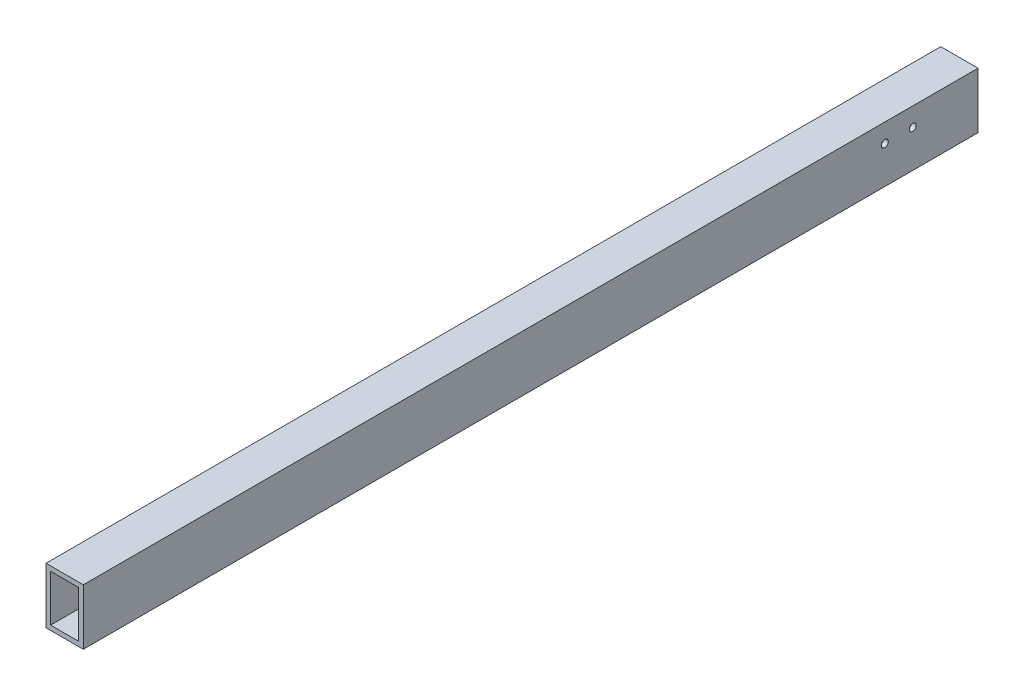
ISO-10303-21;
HEADER;
FILE_DESCRIPTION(('STEP AP214'),'2;1');
FILE_NAME('part.step','',(''),(''),'','','');
FILE_SCHEMA(('AUTOMOTIVE_DESIGN { 1 0 10303 214 1 1 1 1 }'));
ENDSEC;
DATA;
#1=APPLICATION_CONTEXT('core data for automotive mechanical design processes');
#2=APPLICATION_PROTOCOL_DEFINITION('international standard','automotive_design',2000,#1);
#3=PRODUCT_CONTEXT('',#1,'mechanical');
#4=PRODUCT('Part','Part','',(#3));
#5=PRODUCT_RELATED_PRODUCT_CATEGORY('part','',(#4));
#6=PRODUCT_DEFINITION_FORMATION('','',#4);
#7=PRODUCT_DEFINITION_CONTEXT('part definition',#1,'design');
#8=PRODUCT_DEFINITION('design','',#6,#7);
#9=PRODUCT_DEFINITION_SHAPE('','',#8);
#10=(LENGTH_UNIT() NAMED_UNIT(*) SI_UNIT(.MILLI.,.METRE.));
#11=(NAMED_UNIT(*) PLANE_ANGLE_UNIT() SI_UNIT($,.RADIAN.));
#12=(NAMED_UNIT(*) SI_UNIT($,.STERADIAN.) SOLID_ANGLE_UNIT());
#13=UNCERTAINTY_MEASURE_WITH_UNIT(LENGTH_MEASURE(1.E-05),#10,'distance_accuracy_value','');
#14=(GEOMETRIC_REPRESENTATION_CONTEXT(3) GLOBAL_UNCERTAINTY_ASSIGNED_CONTEXT((#13)) GLOBAL_UNIT_ASSIGNED_CONTEXT((#10,
#11,#12)) REPRESENTATION_CONTEXT('',''));
#15=CARTESIAN_POINT('',(0.,0.,0.));
#16=DIRECTION('',(0.,0.,1.));
#17=DIRECTION('',(1.,0.,0.));
#18=AXIS2_PLACEMENT_3D('',#15,#16,#17);
#19=CARTESIAN_POINT('',(12.7,19.05,609.6));
#20=DIRECTION('',(-1.,0.,0.));
#21=DIRECTION('',(0.,-1.,0.));
#22=AXIS2_PLACEMENT_3D('',#19,#20,#21);
#23=PLANE('',#22);
#24=CARTESIAN_POINT('',(12.7,6.35,44.45));
#25=DIRECTION('',(1.,0.,0.));
#26=DIRECTION('',(0.,1.,0.));
#27=AXIS2_PLACEMENT_3D('',#24,#25,#26);
#28=CIRCLE('',#27,2.38125);
#29=CARTESIAN_POINT('',(12.7,8.73125,44.45));
#30=VERTEX_POINT('',#29);
#31=EDGE_CURVE('E171',#30,#30,#28,.T.);
#32=ORIENTED_EDGE('',*,*,#31,.F.);
#33=EDGE_LOOP('',(#32));
#34=FACE_BOUND('',#33,.T.);
#35=CARTESIAN_POINT('',(12.7,6.35,63.5));
#36=DIRECTION('',(1.,0.,0.));
#37=DIRECTION('',(0.,1.,0.));
#38=AXIS2_PLACEMENT_3D('',#35,#36,#37);
#39=CIRCLE('',#38,2.38125);
#40=CARTESIAN_POINT('',(12.7,8.73125,63.5));
#41=VERTEX_POINT('',#40);
#42=EDGE_CURVE('E176',#41,#41,#39,.T.);
#43=ORIENTED_EDGE('',*,*,#42,.F.);
#44=EDGE_LOOP('',(#43));
#45=FACE_BOUND('',#44,.T.);
#46=DIRECTION('',(0.,1.,0.));
#47=VECTOR('',#46,1.);
#48=CARTESIAN_POINT('',(12.7,19.05,0.));
#49=LINE('',#48,#47);
#50=CARTESIAN_POINT('',(12.7,-19.05,0.));
#51=VERTEX_POINT('',#50);
#52=CARTESIAN_POINT('',(12.7,19.05,0.));
#53=VERTEX_POINT('',#52);
#54=EDGE_CURVE('E148',#51,#53,#49,.T.);
#55=ORIENTED_EDGE('',*,*,#54,.T.);
#56=DIRECTION('',(0.,0.,-1.));
#57=VECTOR('',#56,1.);
#58=CARTESIAN_POINT('',(12.7,19.05,609.6));
#59=LINE('',#58,#57);
#60=CARTESIAN_POINT('',(12.7,19.05,609.6));
#61=VERTEX_POINT('',#60);
#62=EDGE_CURVE('E11',#61,#53,#59,.T.);
#63=ORIENTED_EDGE('',*,*,#62,.F.);
#64=DIRECTION('',(0.,1.,0.));
#65=VECTOR('',#64,1.);
#66=CARTESIAN_POINT('',(12.7,19.05,609.6));
#67=LINE('',#66,#65);
#68=CARTESIAN_POINT('',(12.7,-19.05,609.6));
#69=VERTEX_POINT('',#68);
#70=EDGE_CURVE('E137',#69,#61,#67,.T.);
#71=ORIENTED_EDGE('',*,*,#70,.F.);
#72=DIRECTION('',(0.,0.,-1.));
#73=VECTOR('',#72,1.);
#74=CARTESIAN_POINT('',(12.7,-19.05,609.6));
#75=LINE('',#74,#73);
#76=EDGE_CURVE('E147',#69,#51,#75,.T.);
#77=ORIENTED_EDGE('',*,*,#76,.T.);
#78=EDGE_LOOP('',(#55,#63,#71,#77));
#79=FACE_BOUND('',#78,.T.);
#80=ADVANCED_FACE('F37',(#34,#45,#79),#23,.F.);
#81=CARTESIAN_POINT('',(-12.7,19.05,609.6));
#82=DIRECTION('',(0.,-1.,0.));
#83=DIRECTION('',(0.,0.,-1.));
#84=AXIS2_PLACEMENT_3D('',#81,#82,#83);
#85=PLANE('',#84);
#86=DIRECTION('',(-1.,0.,0.));
#87=VECTOR('',#86,1.);
#88=CARTESIAN_POINT('',(-12.7,19.05,0.));
#89=LINE('',#88,#87);
#90=CARTESIAN_POINT('',(-12.7,19.05,0.));
#91=VERTEX_POINT('',#90);
#92=EDGE_CURVE('E151',#53,#91,#89,.T.);
#93=ORIENTED_EDGE('',*,*,#92,.T.);
#94=DIRECTION('',(0.,0.,-1.));
#95=VECTOR('',#94,1.);
#96=CARTESIAN_POINT('',(-12.7,19.05,609.6));
#97=LINE('',#96,#95);
#98=CARTESIAN_POINT('',(-12.7,19.05,609.6));
#99=VERTEX_POINT('',#98);
#100=EDGE_CURVE('E45',#99,#91,#97,.T.);
#101=ORIENTED_EDGE('',*,*,#100,.F.);
#102=DIRECTION('',(-1.,0.,0.));
#103=VECTOR('',#102,1.);
#104=CARTESIAN_POINT('',(-12.7,19.05,609.6));
#105=LINE('',#104,#103);
#106=EDGE_CURVE('E140',#61,#99,#105,.T.);
#107=ORIENTED_EDGE('',*,*,#106,.F.);
#108=ORIENTED_EDGE('',*,*,#62,.T.);
#109=EDGE_LOOP('',(#93,#101,#107,#108));
#110=FACE_BOUND('',#109,.T.);
#111=ADVANCED_FACE('F207',(#110),#85,.F.);
#112=CARTESIAN_POINT('',(-12.7,19.05,609.6));
#113=DIRECTION('',(1.,0.,0.));
#114=DIRECTION('',(0.,1.,0.));
#115=AXIS2_PLACEMENT_3D('',#112,#113,#114);
#116=PLANE('',#115);
#117=CARTESIAN_POINT('',(-12.7,6.35,44.45));
#118=DIRECTION('',(1.,0.,0.));
#119=DIRECTION('',(0.,1.,0.));
#120=AXIS2_PLACEMENT_3D('',#117,#118,#119);
#121=CIRCLE('',#120,2.38125);
#122=CARTESIAN_POINT('',(-12.7,8.73125,44.45));
#123=VERTEX_POINT('',#122);
#124=EDGE_CURVE('E165',#123,#123,#121,.T.);
#125=ORIENTED_EDGE('',*,*,#124,.T.);
#126=EDGE_LOOP('',(#125));
#127=FACE_BOUND('',#126,.T.);
#128=CARTESIAN_POINT('',(-12.7,6.35,63.5));
#129=DIRECTION('',(1.,0.,0.));
#130=DIRECTION('',(0.,1.,0.));
#131=AXIS2_PLACEMENT_3D('',#128,#129,#130);
#132=CIRCLE('',#131,2.38125);
#133=CARTESIAN_POINT('',(-12.7,8.73125,63.5));
#134=VERTEX_POINT('',#133);
#135=EDGE_CURVE('E181',#134,#134,#132,.T.);
#136=ORIENTED_EDGE('',*,*,#135,.T.);
#137=EDGE_LOOP('',(#136));
#138=FACE_BOUND('',#137,.T.);
#139=DIRECTION('',(0.,-1.,0.));
#140=VECTOR('',#139,1.);
#141=CARTESIAN_POINT('',(-12.7,19.05,0.));
#142=LINE('',#141,#140);
#143=CARTESIAN_POINT('',(-12.7,-19.05,0.));
#144=VERTEX_POINT('',#143);
#145=EDGE_CURVE('E153',#91,#144,#142,.T.);
#146=ORIENTED_EDGE('',*,*,#145,.T.);
#147=DIRECTION('',(0.,0.,-1.));
#148=VECTOR('',#147,1.);
#149=CARTESIAN_POINT('',(-12.7,-19.05,609.6));
#150=LINE('',#149,#148);
#151=CARTESIAN_POINT('',(-12.7,-19.05,609.6));
#152=VERTEX_POINT('',#151);
#153=EDGE_CURVE('E158',#152,#144,#150,.T.);
#154=ORIENTED_EDGE('',*,*,#153,.F.);
#155=DIRECTION('',(0.,-1.,0.));
#156=VECTOR('',#155,1.);
#157=CARTESIAN_POINT('',(-12.7,19.05,609.6));
#158=LINE('',#157,#156);
#159=EDGE_CURVE('E143',#99,#152,#158,.T.);
#160=ORIENTED_EDGE('',*,*,#159,.F.);
#161=ORIENTED_EDGE('',*,*,#100,.T.);
#162=EDGE_LOOP('',(#146,#154,#160,#161));
#163=FACE_BOUND('',#162,.T.);
#164=ADVANCED_FACE('F212',(#127,#138,#163),#116,.F.);
#165=CARTESIAN_POINT('',(-12.7,-19.05,609.6));
#166=DIRECTION('',(0.,1.,0.));
#167=DIRECTION('',(0.,0.,1.));
#168=AXIS2_PLACEMENT_3D('',#165,#166,#167);
#169=PLANE('',#168);
#170=DIRECTION('',(1.,0.,0.));
#171=VECTOR('',#170,1.);
#172=CARTESIAN_POINT('',(-12.7,-19.05,0.));
#173=LINE('',#172,#171);
#174=EDGE_CURVE('E141',#144,#51,#173,.T.);
#175=ORIENTED_EDGE('',*,*,#174,.T.);
#176=ORIENTED_EDGE('',*,*,#76,.F.);
#177=DIRECTION('',(1.,0.,0.));
#178=VECTOR('',#177,1.);
#179=CARTESIAN_POINT('',(-12.7,-19.05,609.6));
#180=LINE('',#179,#178);
#181=EDGE_CURVE('E145',#152,#69,#180,.T.);
#182=ORIENTED_EDGE('',*,*,#181,.F.);
#183=ORIENTED_EDGE('',*,*,#153,.T.);
#184=EDGE_LOOP('',(#175,#176,#182,#183));
#185=FACE_BOUND('',#184,.T.);
#186=ADVANCED_FACE('F229',(#185),#169,.F.);
#187=CARTESIAN_POINT('',(0.,0.,609.6));
#188=DIRECTION('',(0.,0.,1.));
#189=DIRECTION('',(1.,0.,0.));
#190=AXIS2_PLACEMENT_3D('',#187,#188,#189);
#191=PLANE('',#190);
#192=DIRECTION('',(0.,1.,0.));
#193=VECTOR('',#192,1.);
#194=CARTESIAN_POINT('',(9.525,19.05,609.6));
#195=LINE('',#194,#193);
#196=CARTESIAN_POINT('',(9.525,-15.875,609.6));
#197=VERTEX_POINT('',#196);
#198=CARTESIAN_POINT('',(9.525,15.875,609.6));
#199=VERTEX_POINT('',#198);
#200=EDGE_CURVE('E125',#197,#199,#195,.T.);
#201=ORIENTED_EDGE('',*,*,#200,.F.);
#202=DIRECTION('',(1.,0.,0.));
#203=VECTOR('',#202,1.);
#204=CARTESIAN_POINT('',(-12.7,-15.875,609.6));
#205=LINE('',#204,#203);
#206=CARTESIAN_POINT('',(-9.525,-15.875,609.6));
#207=VERTEX_POINT('',#206);
#208=EDGE_CURVE('E108',#207,#197,#205,.T.);
#209=ORIENTED_EDGE('',*,*,#208,.F.);
#210=DIRECTION('',(0.,-1.,0.));
#211=VECTOR('',#210,1.);
#212=CARTESIAN_POINT('',(-9.525,19.05,609.6));
#213=LINE('',#212,#211);
#214=CARTESIAN_POINT('',(-9.525,15.875,609.6));
#215=VERTEX_POINT('',#214);
#216=EDGE_CURVE('E134',#215,#207,#213,.T.);
#217=ORIENTED_EDGE('',*,*,#216,.F.);
#218=DIRECTION('',(-1.,0.,0.));
#219=VECTOR('',#218,1.);
#220=CARTESIAN_POINT('',(-12.7,15.875,609.6));
#221=LINE('',#220,#219);
#222=EDGE_CURVE('E127',#199,#215,#221,.T.);
#223=ORIENTED_EDGE('',*,*,#222,.F.);
#224=EDGE_LOOP('',(#201,#209,#217,#223));
#225=FACE_BOUND('',#224,.T.);
#226=ORIENTED_EDGE('',*,*,#70,.T.);
#227=ORIENTED_EDGE('',*,*,#106,.T.);
#228=ORIENTED_EDGE('',*,*,#159,.T.);
#229=ORIENTED_EDGE('',*,*,#181,.T.);
#230=EDGE_LOOP('',(#226,#227,#228,#229));
#231=FACE_BOUND('',#230,.T.);
#232=ADVANCED_FACE('F192',(#225,#231),#191,.T.);
#233=CARTESIAN_POINT('',(0.,0.,0.));
#234=DIRECTION('',(0.,0.,1.));
#235=DIRECTION('',(1.,0.,0.));
#236=AXIS2_PLACEMENT_3D('',#233,#234,#235);
#237=PLANE('',#236);
#238=DIRECTION('',(1.,0.,0.));
#239=VECTOR('',#238,1.);
#240=CARTESIAN_POINT('',(-12.7,-15.875,0.));
#241=LINE('',#240,#239);
#242=CARTESIAN_POINT('',(-9.525,-15.875,0.));
#243=VERTEX_POINT('',#242);
#244=CARTESIAN_POINT('',(9.525,-15.875,0.));
#245=VERTEX_POINT('',#244);
#246=EDGE_CURVE('E106',#243,#245,#241,.T.);
#247=ORIENTED_EDGE('',*,*,#246,.T.);
#248=DIRECTION('',(0.,1.,0.));
#249=VECTOR('',#248,1.);
#250=CARTESIAN_POINT('',(9.525,19.05,0.));
#251=LINE('',#250,#249);
#252=CARTESIAN_POINT('',(9.525,15.875,0.));
#253=VERTEX_POINT('',#252);
#254=EDGE_CURVE('E114',#245,#253,#251,.T.);
#255=ORIENTED_EDGE('',*,*,#254,.T.);
#256=DIRECTION('',(-1.,0.,0.));
#257=VECTOR('',#256,1.);
#258=CARTESIAN_POINT('',(-12.7,15.875,0.));
#259=LINE('',#258,#257);
#260=CARTESIAN_POINT('',(-9.525,15.875,0.));
#261=VERTEX_POINT('',#260);
#262=EDGE_CURVE('E120',#253,#261,#259,.T.);
#263=ORIENTED_EDGE('',*,*,#262,.T.);
#264=DIRECTION('',(0.,-1.,0.));
#265=VECTOR('',#264,1.);
#266=CARTESIAN_POINT('',(-9.525,19.05,0.));
#267=LINE('',#266,#265);
#268=EDGE_CURVE('E60',#261,#243,#267,.T.);
#269=ORIENTED_EDGE('',*,*,#268,.T.);
#270=EDGE_LOOP('',(#247,#255,#263,#269));
#271=FACE_BOUND('',#270,.T.);
#272=ORIENTED_EDGE('',*,*,#54,.F.);
#273=ORIENTED_EDGE('',*,*,#174,.F.);
#274=ORIENTED_EDGE('',*,*,#145,.F.);
#275=ORIENTED_EDGE('',*,*,#92,.F.);
#276=EDGE_LOOP('',(#272,#273,#274,#275));
#277=FACE_BOUND('',#276,.T.);
#278=ADVANCED_FACE('F123',(#271,#277),#237,.F.);
#279=CARTESIAN_POINT('',(9.525,19.05,609.6));
#280=DIRECTION('',(-1.,0.,0.));
#281=DIRECTION('',(0.,-1.,0.));
#282=AXIS2_PLACEMENT_3D('',#279,#280,#281);
#283=PLANE('',#282);
#284=CARTESIAN_POINT('',(9.52499999999999,6.35,44.45));
#285=DIRECTION('',(-1.,0.,0.));
#286=DIRECTION('',(0.,-1.,0.));
#287=AXIS2_PLACEMENT_3D('',#284,#285,#286);
#288=CIRCLE('',#287,2.38125);
#289=CARTESIAN_POINT('',(9.52499999999999,8.73125,44.45));
#290=VERTEX_POINT('',#289);
#291=EDGE_CURVE('E121',#290,#290,#288,.T.);
#292=ORIENTED_EDGE('',*,*,#291,.F.);
#293=EDGE_LOOP('',(#292));
#294=FACE_BOUND('',#293,.T.);
#295=CARTESIAN_POINT('',(9.52499999999999,6.35,63.5));
#296=DIRECTION('',(-1.,0.,0.));
#297=DIRECTION('',(0.,-1.,0.));
#298=AXIS2_PLACEMENT_3D('',#295,#296,#297);
#299=CIRCLE('',#298,2.38125);
#300=CARTESIAN_POINT('',(9.52499999999999,8.73125,63.5));
#301=VERTEX_POINT('',#300);
#302=EDGE_CURVE('E164',#301,#301,#299,.T.);
#303=ORIENTED_EDGE('',*,*,#302,.F.);
#304=EDGE_LOOP('',(#303));
#305=FACE_BOUND('',#304,.T.);
#306=ORIENTED_EDGE('',*,*,#254,.F.);
#307=DIRECTION('',(0.,0.,-1.));
#308=VECTOR('',#307,1.);
#309=CARTESIAN_POINT('',(9.525,-15.875,609.6));
#310=LINE('',#309,#308);
#311=EDGE_CURVE('E102',#197,#245,#310,.T.);
#312=ORIENTED_EDGE('',*,*,#311,.F.);
#313=ORIENTED_EDGE('',*,*,#200,.T.);
#314=DIRECTION('',(0.,0.,-1.));
#315=VECTOR('',#314,1.);
#316=CARTESIAN_POINT('',(9.525,15.875,609.6));
#317=LINE('',#316,#315);
#318=EDGE_CURVE('E117',#199,#253,#317,.T.);
#319=ORIENTED_EDGE('',*,*,#318,.T.);
#320=EDGE_LOOP('',(#306,#312,#313,#319));
#321=FACE_BOUND('',#320,.T.);
#322=ADVANCED_FACE('F115',(#294,#305,#321),#283,.T.);
#323=CARTESIAN_POINT('',(-12.7,15.875,609.6));
#324=DIRECTION('',(0.,-1.,0.));
#325=DIRECTION('',(0.,0.,-1.));
#326=AXIS2_PLACEMENT_3D('',#323,#324,#325);
#327=PLANE('',#326);
#328=ORIENTED_EDGE('',*,*,#262,.F.);
#329=ORIENTED_EDGE('',*,*,#318,.F.);
#330=ORIENTED_EDGE('',*,*,#222,.T.);
#331=DIRECTION('',(0.,0.,-1.));
#332=VECTOR('',#331,1.);
#333=CARTESIAN_POINT('',(-9.525,15.875,609.6));
#334=LINE('',#333,#332);
#335=EDGE_CURVE('E186',#215,#261,#334,.T.);
#336=ORIENTED_EDGE('',*,*,#335,.T.);
#337=EDGE_LOOP('',(#328,#329,#330,#336));
#338=FACE_BOUND('',#337,.T.);
#339=ADVANCED_FACE('F195',(#338),#327,.T.);
#340=CARTESIAN_POINT('',(-9.525,19.05,609.6));
#341=DIRECTION('',(1.,0.,0.));
#342=DIRECTION('',(0.,1.,0.));
#343=AXIS2_PLACEMENT_3D('',#340,#341,#342);
#344=PLANE('',#343);
#345=CARTESIAN_POINT('',(-9.525,6.35,44.45));
#346=DIRECTION('',(1.,0.,0.));
#347=DIRECTION('',(0.,1.,0.));
#348=AXIS2_PLACEMENT_3D('',#345,#346,#347);
#349=CIRCLE('',#348,2.38125);
#350=CARTESIAN_POINT('',(-9.525,8.73125,44.45));
#351=VERTEX_POINT('',#350);
#352=EDGE_CURVE('E40',#351,#351,#349,.T.);
#353=ORIENTED_EDGE('',*,*,#352,.F.);
#354=EDGE_LOOP('',(#353));
#355=FACE_BOUND('',#354,.T.);
#356=CARTESIAN_POINT('',(-9.525,6.35,63.5));
#357=DIRECTION('',(1.,0.,0.));
#358=DIRECTION('',(0.,1.,0.));
#359=AXIS2_PLACEMENT_3D('',#356,#357,#358);
#360=CIRCLE('',#359,2.38125);
#361=CARTESIAN_POINT('',(-9.525,8.73125,63.5));
#362=VERTEX_POINT('',#361);
#363=EDGE_CURVE('E162',#362,#362,#360,.T.);
#364=ORIENTED_EDGE('',*,*,#363,.F.);
#365=EDGE_LOOP('',(#364));
#366=FACE_BOUND('',#365,.T.);
#367=ORIENTED_EDGE('',*,*,#268,.F.);
#368=ORIENTED_EDGE('',*,*,#335,.F.);
#369=ORIENTED_EDGE('',*,*,#216,.T.);
#370=DIRECTION('',(0.,0.,-1.));
#371=VECTOR('',#370,1.);
#372=CARTESIAN_POINT('',(-9.525,-15.875,609.6));
#373=LINE('',#372,#371);
#374=EDGE_CURVE('E53',#207,#243,#373,.T.);
#375=ORIENTED_EDGE('',*,*,#374,.T.);
#376=EDGE_LOOP('',(#367,#368,#369,#375));
#377=FACE_BOUND('',#376,.T.);
#378=ADVANCED_FACE('F188',(#355,#366,#377),#344,.T.);
#379=CARTESIAN_POINT('',(-12.7,-15.875,609.6));
#380=DIRECTION('',(0.,1.,0.));
#381=DIRECTION('',(0.,0.,1.));
#382=AXIS2_PLACEMENT_3D('',#379,#380,#381);
#383=PLANE('',#382);
#384=ORIENTED_EDGE('',*,*,#246,.F.);
#385=ORIENTED_EDGE('',*,*,#374,.F.);
#386=ORIENTED_EDGE('',*,*,#208,.T.);
#387=ORIENTED_EDGE('',*,*,#311,.T.);
#388=EDGE_LOOP('',(#384,#385,#386,#387));
#389=FACE_BOUND('',#388,.T.);
#390=ADVANCED_FACE('F104',(#389),#383,.T.);
#391=CARTESIAN_POINT('',(-12.7,6.35,63.5));
#392=DIRECTION('',(1.,0.,0.));
#393=DIRECTION('',(0.,1.,0.));
#394=AXIS2_PLACEMENT_3D('',#391,#392,#393);
#395=CYLINDRICAL_SURFACE('',#394,2.38125);
#396=CARTESIAN_POINT('',(-9.525,8.73125,63.5));
#397=CARTESIAN_POINT('',(-9.55807291666667,8.73125,63.5));
#398=CARTESIAN_POINT('',(-9.59114583333334,8.73125,63.5));
#399=CARTESIAN_POINT('',(-9.65729166666667,8.73125,63.5));
#400=CARTESIAN_POINT('',(-9.69036458333334,8.73125,63.5));
#401=CARTESIAN_POINT('',(-9.75651041666667,8.73125,63.5));
#402=CARTESIAN_POINT('',(-9.78958333333334,8.73125,63.5));
#403=CARTESIAN_POINT('',(-9.85572916666667,8.73125,63.5));
#404=CARTESIAN_POINT('',(-9.88880208333334,8.73125,63.5));
#405=CARTESIAN_POINT('',(-9.95494791666667,8.73125,63.5));
#406=CARTESIAN_POINT('',(-9.98802083333334,8.73125,63.5));
#407=CARTESIAN_POINT('',(-10.0541666666667,8.73125,63.5));
#408=CARTESIAN_POINT('',(-10.0872395833333,8.73125,63.5));
#409=CARTESIAN_POINT('',(-10.1533854166667,8.73125,63.5));
#410=CARTESIAN_POINT('',(-10.1864583333333,8.73125,63.5));
#411=CARTESIAN_POINT('',(-10.2526041666667,8.73125,63.5));
#412=CARTESIAN_POINT('',(-10.2856770833333,8.73125,63.5));
#413=CARTESIAN_POINT('',(-10.3518229166667,8.73125,63.5));
#414=CARTESIAN_POINT('',(-10.3848958333333,8.73125,63.5));
#415=CARTESIAN_POINT('',(-10.4510416666667,8.73125,63.5));
#416=CARTESIAN_POINT('',(-10.4841145833333,8.73125,63.5));
#417=CARTESIAN_POINT('',(-10.5502604166667,8.73125,63.5));
#418=CARTESIAN_POINT('',(-10.5833333333333,8.73125,63.5));
#419=CARTESIAN_POINT('',(-10.6494791666667,8.73125,63.5));
#420=CARTESIAN_POINT('',(-10.6825520833333,8.73125,63.5));
#421=CARTESIAN_POINT('',(-10.7486979166667,8.73125,63.5));
#422=CARTESIAN_POINT('',(-10.7817708333333,8.73125,63.5));
#423=CARTESIAN_POINT('',(-10.8479166666667,8.73125,63.5));
#424=CARTESIAN_POINT('',(-10.8809895833333,8.73125,63.5));
#425=CARTESIAN_POINT('',(-10.9471354166667,8.73125,63.5));
#426=CARTESIAN_POINT('',(-10.9802083333333,8.73125,63.5));
#427=CARTESIAN_POINT('',(-11.0463541666667,8.73125,63.5));
#428=CARTESIAN_POINT('',(-11.0794270833333,8.73125,63.5));
#429=CARTESIAN_POINT('',(-11.1455729166667,8.73125,63.5));
#430=CARTESIAN_POINT('',(-11.1786458333333,8.73125,63.5));
#431=CARTESIAN_POINT('',(-11.2447916666667,8.73125,63.5));
#432=CARTESIAN_POINT('',(-11.2778645833333,8.73125,63.5));
#433=CARTESIAN_POINT('',(-11.3440104166667,8.73125,63.5));
#434=CARTESIAN_POINT('',(-11.3770833333333,8.73125,63.5));
#435=CARTESIAN_POINT('',(-11.4432291666667,8.73125,63.5));
#436=CARTESIAN_POINT('',(-11.4763020833333,8.73125,63.5));
#437=CARTESIAN_POINT('',(-11.5424479166667,8.73125,63.5));
#438=CARTESIAN_POINT('',(-11.5755208333333,8.73125,63.5));
#439=CARTESIAN_POINT('',(-11.6416666666667,8.73125,63.5));
#440=CARTESIAN_POINT('',(-11.6747395833333,8.73125,63.5));
#441=CARTESIAN_POINT('',(-11.7408854166667,8.73125,63.5));
#442=CARTESIAN_POINT('',(-11.7739583333333,8.73125,63.5));
#443=CARTESIAN_POINT('',(-11.8401041666667,8.73125,63.5));
#444=CARTESIAN_POINT('',(-11.8731770833333,8.73125,63.5));
#445=CARTESIAN_POINT('',(-11.9393229166667,8.73125,63.5));
#446=CARTESIAN_POINT('',(-11.9723958333333,8.73125,63.5));
#447=CARTESIAN_POINT('',(-12.0385416666667,8.73125,63.5));
#448=CARTESIAN_POINT('',(-12.0716145833333,8.73125,63.5));
#449=CARTESIAN_POINT('',(-12.1377604166667,8.73125,63.5));
#450=CARTESIAN_POINT('',(-12.1708333333333,8.73125,63.5));
#451=CARTESIAN_POINT('',(-12.2369791666667,8.73125,63.5));
#452=CARTESIAN_POINT('',(-12.2700520833333,8.73125,63.5));
#453=CARTESIAN_POINT('',(-12.3361979166667,8.73125,63.5));
#454=CARTESIAN_POINT('',(-12.3692708333333,8.73125,63.5));
#455=CARTESIAN_POINT('',(-12.4354166666667,8.73125,63.5));
#456=CARTESIAN_POINT('',(-12.4684895833333,8.73125,63.5));
#457=CARTESIAN_POINT('',(-12.5346354166667,8.73125,63.5));
#458=CARTESIAN_POINT('',(-12.5677083333333,8.73125,63.5));
#459=CARTESIAN_POINT('',(-12.6338541666667,8.73125,63.5));
#460=CARTESIAN_POINT('',(-12.6669270833333,8.73125,63.5));
#461=CARTESIAN_POINT('',(-12.7,8.73125,63.5));
#462=B_SPLINE_CURVE_WITH_KNOTS('',3,(#396,#397,#398,#399,#400,#401,#402,#403,#404,#405,#406,
#407,#408,#409,#410,#411,#412,#413,#414,#415,#416,#417,#418,#419,#420,#421,#422,#423,#424,#425,
#426,#427,#428,#429,#430,#431,#432,#433,#434,#435,#436,#437,#438,#439,#440,#441,#442,#443,#444,
#445,#446,#447,#448,#449,#450,#451,#452,#453,#454,#455,#456,#457,#458,#459,#460,#461),
.UNSPECIFIED.,.F.,.F.,(4,2,2,2,2,2,2,2,2,2,2,2,2,2,2,2,2,2,2,2,2,2,2,2,2,2,2,2,2,2,2,2,4),(0.,
0.0992187499999995,0.198437500000001,0.29765625,0.396875,0.496093750000001,0.5953125,0.69453125,
0.793750000000001,0.892968750000001,0.9921875,1.09140625,1.190625,1.28984375,1.3890625,
1.48828125,1.5875,1.68671875,1.7859375,1.88515625,1.984375,2.08359375,2.1828125,2.28203125,
2.38125,2.48046875,2.5796875,2.67890625,2.778125,2.87734375,2.9765625,3.07578125,3.175),.UNSPECIFIED.);
#463=EDGE_CURVE('BSEAM244',#362,#134,#462,.T.);
#464=ORIENTED_EDGE('',*,*,#363,.T.);
#465=ORIENTED_EDGE('',*,*,#135,.F.);
#466=ORIENTED_EDGE('',*,*,#463,.T.);
#467=ORIENTED_EDGE('',*,*,#463,.F.);
#468=EDGE_LOOP('',(#464,#466,#465,#467));
#469=FACE_BOUND('',#468,.T.);
#470=ADVANCED_FACE('F244',(#469),#395,.F.);
#471=CARTESIAN_POINT('',(-12.7,6.35,44.45));
#472=DIRECTION('',(1.,0.,0.));
#473=DIRECTION('',(0.,1.,0.));
#474=AXIS2_PLACEMENT_3D('',#471,#472,#473);
#475=CYLINDRICAL_SURFACE('',#474,2.38125);
#476=CARTESIAN_POINT('',(-9.525,8.73125,44.45));
#477=CARTESIAN_POINT('',(-9.55807291666667,8.73125,44.45));
#478=CARTESIAN_POINT('',(-9.59114583333334,8.73125,44.45));
#479=CARTESIAN_POINT('',(-9.65729166666667,8.73125,44.45));
#480=CARTESIAN_POINT('',(-9.69036458333334,8.73125,44.45));
#481=CARTESIAN_POINT('',(-9.75651041666667,8.73125,44.45));
#482=CARTESIAN_POINT('',(-9.78958333333334,8.73125,44.45));
#483=CARTESIAN_POINT('',(-9.85572916666667,8.73125,44.45));
#484=CARTESIAN_POINT('',(-9.88880208333334,8.73125,44.45));
#485=CARTESIAN_POINT('',(-9.95494791666667,8.73125,44.45));
#486=CARTESIAN_POINT('',(-9.98802083333334,8.73125,44.45));
#487=CARTESIAN_POINT('',(-10.0541666666667,8.73125,44.45));
#488=CARTESIAN_POINT('',(-10.0872395833333,8.73125,44.45));
#489=CARTESIAN_POINT('',(-10.1533854166667,8.73125,44.45));
#490=CARTESIAN_POINT('',(-10.1864583333333,8.73125,44.45));
#491=CARTESIAN_POINT('',(-10.2526041666667,8.73125,44.45));
#492=CARTESIAN_POINT('',(-10.2856770833333,8.73125,44.45));
#493=CARTESIAN_POINT('',(-10.3518229166667,8.73125,44.45));
#494=CARTESIAN_POINT('',(-10.3848958333333,8.73125,44.45));
#495=CARTESIAN_POINT('',(-10.4510416666667,8.73125,44.45));
#496=CARTESIAN_POINT('',(-10.4841145833333,8.73125,44.45));
#497=CARTESIAN_POINT('',(-10.5502604166667,8.73125,44.45));
#498=CARTESIAN_POINT('',(-10.5833333333333,8.73125,44.45));
#499=CARTESIAN_POINT('',(-10.6494791666667,8.73125,44.45));
#500=CARTESIAN_POINT('',(-10.6825520833333,8.73125,44.45));
#501=CARTESIAN_POINT('',(-10.7486979166667,8.73125,44.45));
#502=CARTESIAN_POINT('',(-10.7817708333333,8.73125,44.45));
#503=CARTESIAN_POINT('',(-10.8479166666667,8.73125,44.45));
#504=CARTESIAN_POINT('',(-10.8809895833333,8.73125,44.45));
#505=CARTESIAN_POINT('',(-10.9471354166667,8.73125,44.45));
#506=CARTESIAN_POINT('',(-10.9802083333333,8.73125,44.45));
#507=CARTESIAN_POINT('',(-11.0463541666667,8.73125,44.45));
#508=CARTESIAN_POINT('',(-11.0794270833333,8.73125,44.45));
#509=CARTESIAN_POINT('',(-11.1455729166667,8.73125,44.45));
#510=CARTESIAN_POINT('',(-11.1786458333333,8.73125,44.45));
#511=CARTESIAN_POINT('',(-11.2447916666667,8.73125,44.45));
#512=CARTESIAN_POINT('',(-11.2778645833333,8.73125,44.45));
#513=CARTESIAN_POINT('',(-11.3440104166667,8.73125,44.45));
#514=CARTESIAN_POINT('',(-11.3770833333333,8.73125,44.45));
#515=CARTESIAN_POINT('',(-11.4432291666667,8.73125,44.45));
#516=CARTESIAN_POINT('',(-11.4763020833333,8.73125,44.45));
#517=CARTESIAN_POINT('',(-11.5424479166667,8.73125,44.45));
#518=CARTESIAN_POINT('',(-11.5755208333333,8.73125,44.45));
#519=CARTESIAN_POINT('',(-11.6416666666667,8.73125,44.45));
#520=CARTESIAN_POINT('',(-11.6747395833333,8.73125,44.45));
#521=CARTESIAN_POINT('',(-11.7408854166667,8.73125,44.45));
#522=CARTESIAN_POINT('',(-11.7739583333333,8.73125,44.45));
#523=CARTESIAN_POINT('',(-11.8401041666667,8.73125,44.45));
#524=CARTESIAN_POINT('',(-11.8731770833333,8.73125,44.45));
#525=CARTESIAN_POINT('',(-11.9393229166667,8.73125,44.45));
#526=CARTESIAN_POINT('',(-11.9723958333333,8.73125,44.45));
#527=CARTESIAN_POINT('',(-12.0385416666667,8.73125,44.45));
#528=CARTESIAN_POINT('',(-12.0716145833333,8.73125,44.45));
#529=CARTESIAN_POINT('',(-12.1377604166667,8.73125,44.45));
#530=CARTESIAN_POINT('',(-12.1708333333333,8.73125,44.45));
#531=CARTESIAN_POINT('',(-12.2369791666667,8.73125,44.45));
#532=CARTESIAN_POINT('',(-12.2700520833333,8.73125,44.45));
#533=CARTESIAN_POINT('',(-12.3361979166667,8.73125,44.45));
#534=CARTESIAN_POINT('',(-12.3692708333333,8.73125,44.45));
#535=CARTESIAN_POINT('',(-12.4354166666667,8.73125,44.45));
#536=CARTESIAN_POINT('',(-12.4684895833333,8.73125,44.45));
#537=CARTESIAN_POINT('',(-12.5346354166667,8.73125,44.45));
#538=CARTESIAN_POINT('',(-12.5677083333333,8.73125,44.45));
#539=CARTESIAN_POINT('',(-12.6338541666667,8.73125,44.45));
#540=CARTESIAN_POINT('',(-12.6669270833333,8.73125,44.45));
#541=CARTESIAN_POINT('',(-12.7,8.73125,44.45));
#542=B_SPLINE_CURVE_WITH_KNOTS('',3,(#476,#477,#478,#479,#480,#481,#482,#483,#484,#485,#486,
#487,#488,#489,#490,#491,#492,#493,#494,#495,#496,#497,#498,#499,#500,#501,#502,#503,#504,#505,
#506,#507,#508,#509,#510,#511,#512,#513,#514,#515,#516,#517,#518,#519,#520,#521,#522,#523,#524,
#525,#526,#527,#528,#529,#530,#531,#532,#533,#534,#535,#536,#537,#538,#539,#540,#541),
.UNSPECIFIED.,.F.,.F.,(4,2,2,2,2,2,2,2,2,2,2,2,2,2,2,2,2,2,2,2,2,2,2,2,2,2,2,2,2,2,2,2,4),(0.,
0.0992187499999995,0.198437500000001,0.29765625,0.396875,0.496093750000001,0.5953125,0.69453125,
0.793750000000001,0.892968750000001,0.9921875,1.09140625,1.190625,1.28984375,1.3890625,
1.48828125,1.5875,1.68671875,1.7859375,1.88515625,1.984375,2.08359375,2.1828125,2.28203125,
2.38125,2.48046875,2.5796875,2.67890625,2.778125,2.87734375,2.9765625,3.07578125,3.175),.UNSPECIFIED.);
#543=EDGE_CURVE('BSEAM248',#351,#123,#542,.T.);
#544=ORIENTED_EDGE('',*,*,#352,.T.);
#545=ORIENTED_EDGE('',*,*,#124,.F.);
#546=ORIENTED_EDGE('',*,*,#543,.T.);
#547=ORIENTED_EDGE('',*,*,#543,.F.);
#548=EDGE_LOOP('',(#544,#546,#545,#547));
#549=FACE_BOUND('',#548,.T.);
#550=ADVANCED_FACE('F248',(#549),#475,.F.);
#551=CARTESIAN_POINT('',(9.52499999999999,8.73125,63.5));
#552=CARTESIAN_POINT('',(9.55807291666666,8.73125,63.5));
#553=CARTESIAN_POINT('',(9.59114583333333,8.73125,63.5));
#554=CARTESIAN_POINT('',(9.65729166666666,8.73125,63.5));
#555=CARTESIAN_POINT('',(9.69036458333333,8.73125,63.5));
#556=CARTESIAN_POINT('',(9.75651041666666,8.73125,63.5));
#557=CARTESIAN_POINT('',(9.78958333333333,8.73125,63.5));
#558=CARTESIAN_POINT('',(9.85572916666666,8.73125,63.5));
#559=CARTESIAN_POINT('',(9.88880208333333,8.73125,63.5));
#560=CARTESIAN_POINT('',(9.95494791666666,8.73125,63.5));
#561=CARTESIAN_POINT('',(9.98802083333333,8.73125,63.5));
#562=CARTESIAN_POINT('',(10.0541666666667,8.73125,63.5));
#563=CARTESIAN_POINT('',(10.0872395833333,8.73125,63.5));
#564=CARTESIAN_POINT('',(10.1533854166667,8.73125,63.5));
#565=CARTESIAN_POINT('',(10.1864583333333,8.73125,63.5));
#566=CARTESIAN_POINT('',(10.2526041666667,8.73125,63.5));
#567=CARTESIAN_POINT('',(10.2856770833333,8.73125,63.5));
#568=CARTESIAN_POINT('',(10.3518229166667,8.73125,63.5));
#569=CARTESIAN_POINT('',(10.3848958333333,8.73125,63.5));
#570=CARTESIAN_POINT('',(10.4510416666667,8.73125,63.5));
#571=CARTESIAN_POINT('',(10.4841145833333,8.73125,63.5));
#572=CARTESIAN_POINT('',(10.5502604166667,8.73125,63.5));
#573=CARTESIAN_POINT('',(10.5833333333333,8.73125,63.5));
#574=CARTESIAN_POINT('',(10.6494791666667,8.73125,63.5));
#575=CARTESIAN_POINT('',(10.6825520833333,8.73125,63.5));
#576=CARTESIAN_POINT('',(10.7486979166667,8.73125,63.5));
#577=CARTESIAN_POINT('',(10.7817708333333,8.73125,63.5));
#578=CARTESIAN_POINT('',(10.8479166666667,8.73125,63.5));
#579=CARTESIAN_POINT('',(10.8809895833333,8.73125,63.5));
#580=CARTESIAN_POINT('',(10.9471354166667,8.73125,63.5));
#581=CARTESIAN_POINT('',(10.9802083333333,8.73125,63.5));
#582=CARTESIAN_POINT('',(11.0463541666667,8.73125,63.5));
#583=CARTESIAN_POINT('',(11.0794270833333,8.73125,63.5));
#584=CARTESIAN_POINT('',(11.1455729166667,8.73125,63.5));
#585=CARTESIAN_POINT('',(11.1786458333333,8.73125,63.5));
#586=CARTESIAN_POINT('',(11.2447916666667,8.73125,63.5));
#587=CARTESIAN_POINT('',(11.2778645833333,8.73125,63.5));
#588=CARTESIAN_POINT('',(11.3440104166667,8.73125,63.5));
#589=CARTESIAN_POINT('',(11.3770833333333,8.73125,63.5));
#590=CARTESIAN_POINT('',(11.4432291666667,8.73125,63.5));
#591=CARTESIAN_POINT('',(11.4763020833333,8.73125,63.5));
#592=CARTESIAN_POINT('',(11.5424479166667,8.73125,63.5));
#593=CARTESIAN_POINT('',(11.5755208333333,8.73125,63.5));
#594=CARTESIAN_POINT('',(11.6416666666667,8.73125,63.5));
#595=CARTESIAN_POINT('',(11.6747395833333,8.73125,63.5));
#596=CARTESIAN_POINT('',(11.7408854166667,8.73125,63.5));
#597=CARTESIAN_POINT('',(11.7739583333333,8.73125,63.5));
#598=CARTESIAN_POINT('',(11.8401041666667,8.73125,63.5));
#599=CARTESIAN_POINT('',(11.8731770833333,8.73125,63.5));
#600=CARTESIAN_POINT('',(11.9393229166667,8.73125,63.5));
#601=CARTESIAN_POINT('',(11.9723958333333,8.73125,63.5));
#602=CARTESIAN_POINT('',(12.0385416666667,8.73125,63.5));
#603=CARTESIAN_POINT('',(12.0716145833333,8.73125,63.5));
#604=CARTESIAN_POINT('',(12.1377604166667,8.73125,63.5));
#605=CARTESIAN_POINT('',(12.1708333333333,8.73125,63.5));
#606=CARTESIAN_POINT('',(12.2369791666667,8.73125,63.5));
#607=CARTESIAN_POINT('',(12.2700520833333,8.73125,63.5));
#608=CARTESIAN_POINT('',(12.3361979166667,8.73125,63.5));
#609=CARTESIAN_POINT('',(12.3692708333333,8.73125,63.5));
#610=CARTESIAN_POINT('',(12.4354166666667,8.73125,63.5));
#611=CARTESIAN_POINT('',(12.4684895833333,8.73125,63.5));
#612=CARTESIAN_POINT('',(12.5346354166667,8.73125,63.5));
#613=CARTESIAN_POINT('',(12.5677083333333,8.73125,63.5));
#614=CARTESIAN_POINT('',(12.6338541666667,8.73125,63.5));
#615=CARTESIAN_POINT('',(12.6669270833333,8.73125,63.5));
#616=CARTESIAN_POINT('',(12.7,8.73125,63.5));
#617=B_SPLINE_CURVE_WITH_KNOTS('',3,(#551,#552,#553,#554,#555,#556,#557,#558,#559,#560,#561,
#562,#563,#564,#565,#566,#567,#568,#569,#570,#571,#572,#573,#574,#575,#576,#577,#578,#579,#580,
#581,#582,#583,#584,#585,#586,#587,#588,#589,#590,#591,#592,#593,#594,#595,#596,#597,#598,#599,
#600,#601,#602,#603,#604,#605,#606,#607,#608,#609,#610,#611,#612,#613,#614,#615,#616),
.UNSPECIFIED.,.F.,.F.,(4,2,2,2,2,2,2,2,2,2,2,2,2,2,2,2,2,2,2,2,2,2,2,2,2,2,2,2,2,2,2,2,4),(0.,
0.0992187500000012,0.198437499999999,0.29765625,0.396875000000001,0.496093749999999,0.5953125,
0.694531250000002,0.793750000000003,0.892968750000001,0.992187500000002,1.09140625,1.190625,
1.28984375,1.3890625,1.48828125,1.5875,1.68671875,1.7859375,1.88515625,1.984375,2.08359375,
2.1828125,2.28203125,2.38125,2.48046875,2.5796875,2.67890625,2.778125,2.87734375,
2.97656250000001,3.07578125,3.175),.UNSPECIFIED.);
#618=EDGE_CURVE('BSEAM250',#301,#41,#617,.T.);
#619=ORIENTED_EDGE('',*,*,#302,.T.);
#620=ORIENTED_EDGE('',*,*,#42,.T.);
#621=ORIENTED_EDGE('',*,*,#618,.T.);
#622=ORIENTED_EDGE('',*,*,#618,.F.);
#623=EDGE_LOOP('',(#619,#621,#620,#622));
#624=FACE_BOUND('',#623,.T.);
#625=ADVANCED_FACE('F250',(#624),#395,.F.);
#626=CARTESIAN_POINT('',(9.52499999999999,8.73125,44.45));
#627=CARTESIAN_POINT('',(9.55807291666666,8.73125,44.45));
#628=CARTESIAN_POINT('',(9.59114583333333,8.73125,44.45));
#629=CARTESIAN_POINT('',(9.65729166666666,8.73125,44.45));
#630=CARTESIAN_POINT('',(9.69036458333333,8.73125,44.45));
#631=CARTESIAN_POINT('',(9.75651041666666,8.73125,44.45));
#632=CARTESIAN_POINT('',(9.78958333333333,8.73125,44.45));
#633=CARTESIAN_POINT('',(9.85572916666666,8.73125,44.45));
#634=CARTESIAN_POINT('',(9.88880208333333,8.73125,44.45));
#635=CARTESIAN_POINT('',(9.95494791666666,8.73125,44.45));
#636=CARTESIAN_POINT('',(9.98802083333333,8.73125,44.45));
#637=CARTESIAN_POINT('',(10.0541666666667,8.73125,44.45));
#638=CARTESIAN_POINT('',(10.0872395833333,8.73125,44.45));
#639=CARTESIAN_POINT('',(10.1533854166667,8.73125,44.45));
#640=CARTESIAN_POINT('',(10.1864583333333,8.73125,44.45));
#641=CARTESIAN_POINT('',(10.2526041666667,8.73125,44.45));
#642=CARTESIAN_POINT('',(10.2856770833333,8.73125,44.45));
#643=CARTESIAN_POINT('',(10.3518229166667,8.73125,44.45));
#644=CARTESIAN_POINT('',(10.3848958333333,8.73125,44.45));
#645=CARTESIAN_POINT('',(10.4510416666667,8.73125,44.45));
#646=CARTESIAN_POINT('',(10.4841145833333,8.73125,44.45));
#647=CARTESIAN_POINT('',(10.5502604166667,8.73125,44.45));
#648=CARTESIAN_POINT('',(10.5833333333333,8.73125,44.45));
#649=CARTESIAN_POINT('',(10.6494791666667,8.73125,44.45));
#650=CARTESIAN_POINT('',(10.6825520833333,8.73125,44.45));
#651=CARTESIAN_POINT('',(10.7486979166667,8.73125,44.45));
#652=CARTESIAN_POINT('',(10.7817708333333,8.73125,44.45));
#653=CARTESIAN_POINT('',(10.8479166666667,8.73125,44.45));
#654=CARTESIAN_POINT('',(10.8809895833333,8.73125,44.45));
#655=CARTESIAN_POINT('',(10.9471354166667,8.73125,44.45));
#656=CARTESIAN_POINT('',(10.9802083333333,8.73125,44.45));
#657=CARTESIAN_POINT('',(11.0463541666667,8.73125,44.45));
#658=CARTESIAN_POINT('',(11.0794270833333,8.73125,44.45));
#659=CARTESIAN_POINT('',(11.1455729166667,8.73125,44.45));
#660=CARTESIAN_POINT('',(11.1786458333333,8.73125,44.45));
#661=CARTESIAN_POINT('',(11.2447916666667,8.73125,44.45));
#662=CARTESIAN_POINT('',(11.2778645833333,8.73125,44.45));
#663=CARTESIAN_POINT('',(11.3440104166667,8.73125,44.45));
#664=CARTESIAN_POINT('',(11.3770833333333,8.73125,44.45));
#665=CARTESIAN_POINT('',(11.4432291666667,8.73125,44.45));
#666=CARTESIAN_POINT('',(11.4763020833333,8.73125,44.45));
#667=CARTESIAN_POINT('',(11.5424479166667,8.73125,44.45));
#668=CARTESIAN_POINT('',(11.5755208333333,8.73125,44.45));
#669=CARTESIAN_POINT('',(11.6416666666667,8.73125,44.45));
#670=CARTESIAN_POINT('',(11.6747395833333,8.73125,44.45));
#671=CARTESIAN_POINT('',(11.7408854166667,8.73125,44.45));
#672=CARTESIAN_POINT('',(11.7739583333333,8.73125,44.45));
#673=CARTESIAN_POINT('',(11.8401041666667,8.73125,44.45));
#674=CARTESIAN_POINT('',(11.8731770833333,8.73125,44.45));
#675=CARTESIAN_POINT('',(11.9393229166667,8.73125,44.45));
#676=CARTESIAN_POINT('',(11.9723958333333,8.73125,44.45));
#677=CARTESIAN_POINT('',(12.0385416666667,8.73125,44.45));
#678=CARTESIAN_POINT('',(12.0716145833333,8.73125,44.45));
#679=CARTESIAN_POINT('',(12.1377604166667,8.73125,44.45));
#680=CARTESIAN_POINT('',(12.1708333333333,8.73125,44.45));
#681=CARTESIAN_POINT('',(12.2369791666667,8.73125,44.45));
#682=CARTESIAN_POINT('',(12.2700520833333,8.73125,44.45));
#683=CARTESIAN_POINT('',(12.3361979166667,8.73125,44.45));
#684=CARTESIAN_POINT('',(12.3692708333333,8.73125,44.45));
#685=CARTESIAN_POINT('',(12.4354166666667,8.73125,44.45));
#686=CARTESIAN_POINT('',(12.4684895833333,8.73125,44.45));
#687=CARTESIAN_POINT('',(12.5346354166667,8.73125,44.45));
#688=CARTESIAN_POINT('',(12.5677083333333,8.73125,44.45));
#689=CARTESIAN_POINT('',(12.6338541666667,8.73125,44.45));
#690=CARTESIAN_POINT('',(12.6669270833333,8.73125,44.45));
#691=CARTESIAN_POINT('',(12.7,8.73125,44.45));
#692=B_SPLINE_CURVE_WITH_KNOTS('',3,(#626,#627,#628,#629,#630,#631,#632,#633,#634,#635,#636,
#637,#638,#639,#640,#641,#642,#643,#644,#645,#646,#647,#648,#649,#650,#651,#652,#653,#654,#655,
#656,#657,#658,#659,#660,#661,#662,#663,#664,#665,#666,#667,#668,#669,#670,#671,#672,#673,#674,
#675,#676,#677,#678,#679,#680,#681,#682,#683,#684,#685,#686,#687,#688,#689,#690,#691),
.UNSPECIFIED.,.F.,.F.,(4,2,2,2,2,2,2,2,2,2,2,2,2,2,2,2,2,2,2,2,2,2,2,2,2,2,2,2,2,2,2,2,4),(0.,
0.0992187500000012,0.198437499999999,0.29765625,0.396875000000001,0.496093749999999,0.5953125,
0.694531250000002,0.793750000000003,0.892968750000001,0.992187500000002,1.09140625,1.190625,
1.28984375,1.3890625,1.48828125,1.5875,1.68671875,1.7859375,1.88515625,1.984375,2.08359375,
2.1828125,2.28203125,2.38125,2.48046875,2.5796875,2.67890625,2.778125,2.87734375,
2.97656250000001,3.07578125,3.175),.UNSPECIFIED.);
#693=EDGE_CURVE('BSEAM256',#290,#30,#692,.T.);
#694=ORIENTED_EDGE('',*,*,#291,.T.);
#695=ORIENTED_EDGE('',*,*,#31,.T.);
#696=ORIENTED_EDGE('',*,*,#693,.T.);
#697=ORIENTED_EDGE('',*,*,#693,.F.);
#698=EDGE_LOOP('',(#694,#696,#695,#697));
#699=FACE_BOUND('',#698,.T.);
#700=ADVANCED_FACE('F256',(#699),#475,.F.);
#701=CLOSED_SHELL('',(#80,#111,#164,#186,#232,#278,#322,#339,#378,#390,#470,#550,#625,#700));
#702=MANIFOLD_SOLID_BREP('B2',#701);
#703=ADVANCED_BREP_SHAPE_REPRESENTATION('',(#18,#702),#14);
#704=SHAPE_DEFINITION_REPRESENTATION(#9,#703);
ENDSEC;
END-ISO-10303-21;
